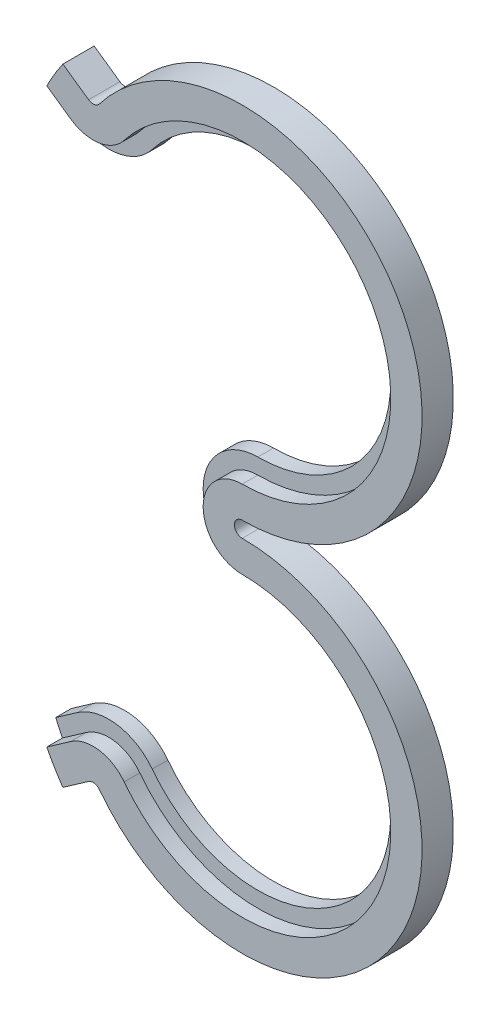
ISO-10303-21;
HEADER;
FILE_DESCRIPTION(('STEP AP214'),'2;1');
FILE_NAME('part.step','',(''),(''),'','','');
FILE_SCHEMA(('AUTOMOTIVE_DESIGN { 1 0 10303 214 1 1 1 1 }'));
ENDSEC;
DATA;
#1=APPLICATION_CONTEXT('core data for automotive mechanical design processes');
#2=APPLICATION_PROTOCOL_DEFINITION('international standard','automotive_design',2000,#1);
#3=PRODUCT_CONTEXT('',#1,'mechanical');
#4=PRODUCT('Part','Part','',(#3));
#5=PRODUCT_RELATED_PRODUCT_CATEGORY('part','',(#4));
#6=PRODUCT_DEFINITION_FORMATION('','',#4);
#7=PRODUCT_DEFINITION_CONTEXT('part definition',#1,'design');
#8=PRODUCT_DEFINITION('design','',#6,#7);
#9=PRODUCT_DEFINITION_SHAPE('','',#8);
#10=(LENGTH_UNIT() NAMED_UNIT(*) SI_UNIT(.MILLI.,.METRE.));
#11=(NAMED_UNIT(*) PLANE_ANGLE_UNIT() SI_UNIT($,.RADIAN.));
#12=(NAMED_UNIT(*) SI_UNIT($,.STERADIAN.) SOLID_ANGLE_UNIT());
#13=UNCERTAINTY_MEASURE_WITH_UNIT(LENGTH_MEASURE(1.E-05),#10,'distance_accuracy_value','');
#14=(GEOMETRIC_REPRESENTATION_CONTEXT(3) GLOBAL_UNCERTAINTY_ASSIGNED_CONTEXT((#13)) GLOBAL_UNIT_ASSIGNED_CONTEXT((#10,
#11,#12)) REPRESENTATION_CONTEXT('',''));
#15=CARTESIAN_POINT('',(0.,0.,0.));
#16=DIRECTION('',(0.,0.,1.));
#17=DIRECTION('',(1.,0.,0.));
#18=AXIS2_PLACEMENT_3D('',#15,#16,#17);
#19=CARTESIAN_POINT('',(-12.9224650406686,17.3860836674432,2.));
#20=DIRECTION('',(0.573576436351046,0.819152044288992,0.));
#21=DIRECTION('',(-0.819152044288992,0.573576436351046,0.));
#22=AXIS2_PLACEMENT_3D('',#19,#20,#21);
#23=PLANE('',#22);
#24=DIRECTION('',(0.819152044288991,-0.573576436351047,0.));
#25=VECTOR('',#24,1.);
#26=CARTESIAN_POINT('',(-12.9224650406686,17.3860836674432,1.));
#27=LINE('',#26,#25);
#28=CARTESIAN_POINT('',(-12.9224650406686,17.3860836674432,1.));
#29=VERTEX_POINT('',#28);
#30=CARTESIAN_POINT('',(-11.5420173000212,16.4194837533373,1.));
#31=VERTEX_POINT('',#30);
#32=EDGE_CURVE('E283',#29,#31,#27,.T.);
#33=ORIENTED_EDGE('',*,*,#32,.F.);
#34=DIRECTION('',(0.,0.,-1.));
#35=VECTOR('',#34,1.);
#36=CARTESIAN_POINT('',(-12.9224650406686,17.3860836674432,2.));
#37=LINE('',#36,#35);
#38=CARTESIAN_POINT('',(-12.9224650406686,17.3860836674432,0.));
#39=VERTEX_POINT('',#38);
#40=EDGE_CURVE('E241',#29,#39,#37,.T.);
#41=ORIENTED_EDGE('',*,*,#40,.T.);
#42=DIRECTION('',(0.819152044288992,-0.573576436351046,0.));
#43=VECTOR('',#42,1.);
#44=CARTESIAN_POINT('',(-12.9224650406686,17.3860836674432,0.));
#45=LINE('',#44,#43);
#46=CARTESIAN_POINT('',(-11.5420173000212,16.4194837533373,0.));
#47=VERTEX_POINT('',#46);
#48=EDGE_CURVE('E175',#39,#47,#45,.T.);
#49=ORIENTED_EDGE('',*,*,#48,.T.);
#50=DIRECTION('',(0.,0.,-1.));
#51=VECTOR('',#50,1.);
#52=CARTESIAN_POINT('',(-11.5420173000212,16.4194837533373,2.));
#53=LINE('',#52,#51);
#54=EDGE_CURVE('E239',#31,#47,#53,.T.);
#55=ORIENTED_EDGE('',*,*,#54,.F.);
#56=EDGE_LOOP('',(#33,#41,#49,#55));
#57=FACE_BOUND('',#56,.T.);
#58=ADVANCED_FACE('F39',(#57),#23,.F.);
#59=CARTESIAN_POINT('',(-9.53449977279251,19.2865159083488,2.));
#60=DIRECTION('',(0.,0.,-1.));
#61=DIRECTION('',(-1.,0.,0.));
#62=AXIS2_PLACEMENT_3D('',#59,#60,#61);
#63=CYLINDRICAL_SURFACE('',#62,3.5);
#64=CARTESIAN_POINT('',(-9.53449977279251,19.2865159083488,1.));
#65=DIRECTION('',(0.,0.,1.));
#66=DIRECTION('',(1.,0.,0.));
#67=AXIS2_PLACEMENT_3D('',#64,#65,#66);
#68=CIRCLE('',#67,3.5);
#69=CARTESIAN_POINT('',(-6.75360400572803,17.161282101747,1.));
#70=VERTEX_POINT('',#69);
#71=EDGE_CURVE('E393',#31,#70,#68,.T.);
#72=ORIENTED_EDGE('',*,*,#71,.F.);
#73=ORIENTED_EDGE('',*,*,#54,.T.);
#74=CARTESIAN_POINT('',(-9.53449977279251,19.2865159083488,0.));
#75=DIRECTION('',(0.,0.,1.));
#76=DIRECTION('',(1.,0.,0.));
#77=AXIS2_PLACEMENT_3D('',#74,#75,#76);
#78=CIRCLE('',#77,3.5);
#79=CARTESIAN_POINT('',(-6.75360400572803,17.161282101747,0.));
#80=VERTEX_POINT('',#79);
#81=EDGE_CURVE('E179',#47,#80,#78,.T.);
#82=ORIENTED_EDGE('',*,*,#81,.T.);
#83=DIRECTION('',(0.,0.,-1.));
#84=VECTOR('',#83,1.);
#85=CARTESIAN_POINT('',(-6.75360400572803,17.161282101747,2.));
#86=LINE('',#85,#84);
#87=EDGE_CURVE('E237',#70,#80,#86,.T.);
#88=ORIENTED_EDGE('',*,*,#87,.F.);
#89=EDGE_LOOP('',(#72,#73,#82,#88));
#90=FACE_BOUND('',#89,.T.);
#91=ADVANCED_FACE('F400',(#90),#63,.T.);
#92=CARTESIAN_POINT('',(0.,12.,2.));
#93=DIRECTION('',(0.,0.,-1.));
#94=DIRECTION('',(-1.,0.,0.));
#95=AXIS2_PLACEMENT_3D('',#92,#93,#94);
#96=CYLINDRICAL_SURFACE('',#95,8.5);
#97=CARTESIAN_POINT('',(0.,12.,1.));
#98=DIRECTION('',(0.,0.,-1.));
#99=DIRECTION('',(1.,0.,0.));
#100=AXIS2_PLACEMENT_3D('',#97,#98,#99);
#101=CIRCLE('',#100,8.5);
#102=CARTESIAN_POINT('',(0.,3.5,1.));
#103=VERTEX_POINT('',#102);
#104=EDGE_CURVE('E402',#70,#103,#101,.T.);
#105=ORIENTED_EDGE('',*,*,#104,.F.);
#106=ORIENTED_EDGE('',*,*,#87,.T.);
#107=CARTESIAN_POINT('',(0.,12.,0.));
#108=DIRECTION('',(0.,0.,-1.));
#109=DIRECTION('',(1.,0.,0.));
#110=AXIS2_PLACEMENT_3D('',#107,#108,#109);
#111=CIRCLE('',#110,8.5);
#112=CARTESIAN_POINT('',(0.,3.5,0.));
#113=VERTEX_POINT('',#112);
#114=EDGE_CURVE('E182',#80,#113,#111,.T.);
#115=ORIENTED_EDGE('',*,*,#114,.T.);
#116=DIRECTION('',(0.,0.,-1.));
#117=VECTOR('',#116,1.);
#118=CARTESIAN_POINT('',(0.,3.5,2.));
#119=LINE('',#118,#117);
#120=EDGE_CURVE('E235',#103,#113,#119,.T.);
#121=ORIENTED_EDGE('',*,*,#120,.F.);
#122=EDGE_LOOP('',(#105,#106,#115,#121));
#123=FACE_BOUND('',#122,.T.);
#124=ADVANCED_FACE('F444',(#123),#96,.F.);
#125=CARTESIAN_POINT('',(0.,0.,2.));
#126=DIRECTION('',(0.,0.,-1.));
#127=DIRECTION('',(-1.,0.,0.));
#128=AXIS2_PLACEMENT_3D('',#125,#126,#127);
#129=CYLINDRICAL_SURFACE('',#128,3.5);
#130=CARTESIAN_POINT('',(0.,0.,1.));
#131=DIRECTION('',(0.,0.,1.));
#132=DIRECTION('',(1.,0.,0.));
#133=AXIS2_PLACEMENT_3D('',#130,#131,#132);
#134=CIRCLE('',#133,3.5);
#135=CARTESIAN_POINT('',(0.,-3.5,1.));
#136=VERTEX_POINT('',#135);
#137=EDGE_CURVE('E404',#103,#136,#134,.T.);
#138=ORIENTED_EDGE('',*,*,#137,.F.);
#139=ORIENTED_EDGE('',*,*,#120,.T.);
#140=CARTESIAN_POINT('',(0.,0.,0.));
#141=DIRECTION('',(0.,0.,1.));
#142=DIRECTION('',(1.,0.,0.));
#143=AXIS2_PLACEMENT_3D('',#140,#141,#142);
#144=CIRCLE('',#143,3.5);
#145=CARTESIAN_POINT('',(0.,-3.5,0.));
#146=VERTEX_POINT('',#145);
#147=EDGE_CURVE('E185',#113,#146,#144,.T.);
#148=ORIENTED_EDGE('',*,*,#147,.T.);
#149=DIRECTION('',(0.,0.,-1.));
#150=VECTOR('',#149,1.);
#151=CARTESIAN_POINT('',(0.,-3.5,2.));
#152=LINE('',#151,#150);
#153=EDGE_CURVE('E233',#136,#146,#152,.T.);
#154=ORIENTED_EDGE('',*,*,#153,.F.);
#155=EDGE_LOOP('',(#138,#139,#148,#154));
#156=FACE_BOUND('',#155,.T.);
#157=ADVANCED_FACE('F449',(#156),#129,.T.);
#158=CARTESIAN_POINT('',(0.,-12.,2.));
#159=DIRECTION('',(0.,0.,-1.));
#160=DIRECTION('',(-1.,0.,0.));
#161=AXIS2_PLACEMENT_3D('',#158,#159,#160);
#162=CYLINDRICAL_SURFACE('',#161,8.5);
#163=CARTESIAN_POINT('',(0.,-12.,1.));
#164=DIRECTION('',(0.,0.,-1.));
#165=DIRECTION('',(1.,0.,0.));
#166=AXIS2_PLACEMENT_3D('',#163,#164,#165);
#167=CIRCLE('',#166,8.5);
#168=CARTESIAN_POINT('',(-6.75360400572803,-17.161282101747,1.));
#169=VERTEX_POINT('',#168);
#170=EDGE_CURVE('E408',#136,#169,#167,.T.);
#171=ORIENTED_EDGE('',*,*,#170,.F.);
#172=ORIENTED_EDGE('',*,*,#153,.T.);
#173=CARTESIAN_POINT('',(0.,-12.,0.));
#174=DIRECTION('',(0.,0.,-1.));
#175=DIRECTION('',(1.,0.,0.));
#176=AXIS2_PLACEMENT_3D('',#173,#174,#175);
#177=CIRCLE('',#176,8.5);
#178=CARTESIAN_POINT('',(-6.75360400572803,-17.161282101747,0.));
#179=VERTEX_POINT('',#178);
#180=EDGE_CURVE('E188',#146,#179,#177,.T.);
#181=ORIENTED_EDGE('',*,*,#180,.T.);
#182=DIRECTION('',(0.,0.,-1.));
#183=VECTOR('',#182,1.);
#184=CARTESIAN_POINT('',(-6.75360400572803,-17.161282101747,2.));
#185=LINE('',#184,#183);
#186=EDGE_CURVE('E231',#169,#179,#185,.T.);
#187=ORIENTED_EDGE('',*,*,#186,.F.);
#188=EDGE_LOOP('',(#171,#172,#181,#187));
#189=FACE_BOUND('',#188,.T.);
#190=ADVANCED_FACE('F453',(#189),#162,.F.);
#191=CARTESIAN_POINT('',(-9.53449977279251,-19.2865159083488,2.));
#192=DIRECTION('',(0.,0.,-1.));
#193=DIRECTION('',(-1.,0.,0.));
#194=AXIS2_PLACEMENT_3D('',#191,#192,#193);
#195=CYLINDRICAL_SURFACE('',#194,3.5);
#196=CARTESIAN_POINT('',(-9.53449977279251,-19.2865159083488,1.));
#197=DIRECTION('',(0.,0.,1.));
#198=DIRECTION('',(1.,0.,0.));
#199=AXIS2_PLACEMENT_3D('',#196,#197,#198);
#200=CIRCLE('',#199,3.5);
#201=CARTESIAN_POINT('',(-11.5420173000212,-16.4194837533373,1.));
#202=VERTEX_POINT('',#201);
#203=EDGE_CURVE('E410',#169,#202,#200,.T.);
#204=ORIENTED_EDGE('',*,*,#203,.F.);
#205=ORIENTED_EDGE('',*,*,#186,.T.);
#206=CARTESIAN_POINT('',(-9.53449977279251,-19.2865159083488,0.));
#207=DIRECTION('',(0.,0.,1.));
#208=DIRECTION('',(1.,0.,0.));
#209=AXIS2_PLACEMENT_3D('',#206,#207,#208);
#210=CIRCLE('',#209,3.5);
#211=CARTESIAN_POINT('',(-11.5420173000212,-16.4194837533373,0.));
#212=VERTEX_POINT('',#211);
#213=EDGE_CURVE('E191',#179,#212,#210,.T.);
#214=ORIENTED_EDGE('',*,*,#213,.T.);
#215=DIRECTION('',(0.,0.,-1.));
#216=VECTOR('',#215,1.);
#217=CARTESIAN_POINT('',(-11.5420173000212,-16.4194837533373,2.));
#218=LINE('',#217,#216);
#219=EDGE_CURVE('E229',#202,#212,#218,.T.);
#220=ORIENTED_EDGE('',*,*,#219,.F.);
#221=EDGE_LOOP('',(#204,#205,#214,#220));
#222=FACE_BOUND('',#221,.T.);
#223=ADVANCED_FACE('F457',(#222),#195,.T.);
#224=CARTESIAN_POINT('',(-11.5420173000212,-16.4194837533373,2.));
#225=DIRECTION('',(0.573576436351046,-0.819152044288992,0.));
#226=DIRECTION('',(0.819152044288992,0.573576436351046,0.));
#227=AXIS2_PLACEMENT_3D('',#224,#225,#226);
#228=PLANE('',#227);
#229=DIRECTION('',(-0.819152044288993,-0.573576436351044,0.));
#230=VECTOR('',#229,1.);
#231=CARTESIAN_POINT('',(-11.5420173000212,-16.4194837533373,1.));
#232=LINE('',#231,#230);
#233=CARTESIAN_POINT('',(-12.9224650406686,-17.3860836674432,1.));
#234=VERTEX_POINT('',#233);
#235=EDGE_CURVE('E412',#202,#234,#232,.T.);
#236=ORIENTED_EDGE('',*,*,#235,.F.);
#237=ORIENTED_EDGE('',*,*,#219,.T.);
#238=DIRECTION('',(-0.819152044288992,-0.573576436351046,0.));
#239=VECTOR('',#238,1.);
#240=CARTESIAN_POINT('',(-11.5420173000212,-16.4194837533373,0.));
#241=LINE('',#240,#239);
#242=CARTESIAN_POINT('',(-12.9224650406686,-17.3860836674432,0.));
#243=VERTEX_POINT('',#242);
#244=EDGE_CURVE('E194',#212,#243,#241,.T.);
#245=ORIENTED_EDGE('',*,*,#244,.T.);
#246=DIRECTION('',(0.,0.,-1.));
#247=VECTOR('',#246,1.);
#248=CARTESIAN_POINT('',(-12.9224650406686,-17.3860836674432,2.));
#249=LINE('',#248,#247);
#250=EDGE_CURVE('E227',#234,#243,#249,.T.);
#251=ORIENTED_EDGE('',*,*,#250,.F.);
#252=EDGE_LOOP('',(#236,#237,#245,#251));
#253=FACE_BOUND('',#252,.T.);
#254=ADVANCED_FACE('F461',(#253),#228,.F.);
#255=CARTESIAN_POINT('',(0.,12.,2.));
#256=DIRECTION('',(0.,0.,-1.));
#257=DIRECTION('',(-1.,0.,0.));
#258=AXIS2_PLACEMENT_3D('',#255,#256,#257);
#259=CYLINDRICAL_SURFACE('',#258,14.);
#260=CARTESIAN_POINT('',(0.,12.,1.));
#261=DIRECTION('',(0.,0.,1.));
#262=DIRECTION('',(1.,0.,0.));
#263=AXIS2_PLACEMENT_3D('',#260,#261,#262);
#264=CIRCLE('',#263,14.);
#265=CARTESIAN_POINT('',(-12.4976565513617,18.3094041496965,1.));
#266=VERTEX_POINT('',#265);
#267=EDGE_CURVE('E176',#266,#29,#264,.T.);
#268=ORIENTED_EDGE('',*,*,#267,.F.);
#269=DIRECTION('',(0.,0.,-1.));
#270=VECTOR('',#269,1.);
#271=CARTESIAN_POINT('',(-12.4976565513617,18.3094041496965,2.));
#272=LINE('',#271,#270);
#273=CARTESIAN_POINT('',(-12.4976565513617,18.3094041496965,2.));
#274=VERTEX_POINT('',#273);
#275=EDGE_CURVE('E299',#266,#274,#272,.F.);
#276=ORIENTED_EDGE('',*,*,#275,.T.);
#277=CARTESIAN_POINT('',(0.,12.,2.));
#278=DIRECTION('',(0.,0.,1.));
#279=DIRECTION('',(1.,0.,0.));
#280=AXIS2_PLACEMENT_3D('',#277,#278,#279);
#281=CIRCLE('',#280,14.);
#282=CARTESIAN_POINT('',(-11.4681286200459,20.0300701089146,2.));
#283=VERTEX_POINT('',#282);
#284=EDGE_CURVE('E211',#283,#274,#281,.T.);
#285=ORIENTED_EDGE('',*,*,#284,.F.);
#286=DIRECTION('',(0.,0.,-1.));
#287=VECTOR('',#286,1.);
#288=CARTESIAN_POINT('',(-11.4681286200459,20.0300701089146,2.));
#289=LINE('',#288,#287);
#290=CARTESIAN_POINT('',(-11.4681286200459,20.0300701089146,0.));
#291=VERTEX_POINT('',#290);
#292=EDGE_CURVE('E168',#283,#291,#289,.T.);
#293=ORIENTED_EDGE('',*,*,#292,.T.);
#294=CARTESIAN_POINT('',(0.,12.,0.));
#295=DIRECTION('',(0.,0.,1.));
#296=DIRECTION('',(1.,0.,0.));
#297=AXIS2_PLACEMENT_3D('',#294,#295,#296);
#298=CIRCLE('',#297,14.);
#299=EDGE_CURVE('E172',#291,#39,#298,.T.);
#300=ORIENTED_EDGE('',*,*,#299,.T.);
#301=ORIENTED_EDGE('',*,*,#40,.F.);
#302=EDGE_LOOP('',(#268,#276,#285,#293,#300,#301));
#303=FACE_BOUND('',#302,.T.);
#304=ADVANCED_FACE('F41',(#303),#259,.T.);
#305=CARTESIAN_POINT('',(0.,-12.,2.));
#306=DIRECTION('',(0.,0.,-1.));
#307=DIRECTION('',(-1.,0.,0.));
#308=AXIS2_PLACEMENT_3D('',#305,#306,#307);
#309=CYLINDRICAL_SURFACE('',#308,14.);
#310=CARTESIAN_POINT('',(0.,-12.,2.));
#311=DIRECTION('',(0.,0.,1.));
#312=DIRECTION('',(1.,0.,0.));
#313=AXIS2_PLACEMENT_3D('',#310,#311,#312);
#314=CIRCLE('',#313,14.);
#315=CARTESIAN_POINT('',(-12.4976565513617,-18.3094041496964,2.));
#316=VERTEX_POINT('',#315);
#317=CARTESIAN_POINT('',(-11.4681286200459,-20.0300701089146,2.));
#318=VERTEX_POINT('',#317);
#319=EDGE_CURVE('E127',#316,#318,#314,.T.);
#320=ORIENTED_EDGE('',*,*,#319,.F.);
#321=DIRECTION('',(0.,0.,-1.));
#322=VECTOR('',#321,1.);
#323=CARTESIAN_POINT('',(-12.4976565513617,-18.3094041496964,2.));
#324=LINE('',#323,#322);
#325=CARTESIAN_POINT('',(-12.4976565513617,-18.3094041496964,1.));
#326=VERTEX_POINT('',#325);
#327=EDGE_CURVE('E54',#316,#326,#324,.T.);
#328=ORIENTED_EDGE('',*,*,#327,.T.);
#329=CARTESIAN_POINT('',(0.,-12.,1.));
#330=DIRECTION('',(0.,0.,1.));
#331=DIRECTION('',(1.,0.,0.));
#332=AXIS2_PLACEMENT_3D('',#329,#330,#331);
#333=CIRCLE('',#332,14.);
#334=EDGE_CURVE('E11',#234,#326,#333,.T.);
#335=ORIENTED_EDGE('',*,*,#334,.F.);
#336=ORIENTED_EDGE('',*,*,#250,.T.);
#337=CARTESIAN_POINT('',(0.,-12.,0.));
#338=DIRECTION('',(0.,0.,1.));
#339=DIRECTION('',(1.,0.,0.));
#340=AXIS2_PLACEMENT_3D('',#337,#338,#339);
#341=CIRCLE('',#340,14.);
#342=CARTESIAN_POINT('',(-11.4681286200459,-20.0300701089146,0.));
#343=VERTEX_POINT('',#342);
#344=EDGE_CURVE('E197',#243,#343,#341,.T.);
#345=ORIENTED_EDGE('',*,*,#344,.T.);
#346=DIRECTION('',(0.,0.,-1.));
#347=VECTOR('',#346,1.);
#348=CARTESIAN_POINT('',(-11.4681286200459,-20.0300701089146,2.));
#349=LINE('',#348,#347);
#350=EDGE_CURVE('E224',#318,#343,#349,.T.);
#351=ORIENTED_EDGE('',*,*,#350,.F.);
#352=EDGE_LOOP('',(#320,#328,#335,#336,#345,#351));
#353=FACE_BOUND('',#352,.T.);
#354=ADVANCED_FACE('F466',(#353),#309,.T.);
#355=CARTESIAN_POINT('',(-11.4681286200459,-20.0300701089146,2.));
#356=DIRECTION('',(-0.573576436351044,0.819152044288993,0.));
#357=DIRECTION('',(-0.819152044288993,-0.573576436351044,0.));
#358=AXIS2_PLACEMENT_3D('',#355,#356,#357);
#359=PLANE('',#358);
#360=DIRECTION('',(0.819152044288993,0.573576436351044,0.));
#361=VECTOR('',#360,1.);
#362=CARTESIAN_POINT('',(-11.4681286200459,-20.0300701089146,0.));
#363=LINE('',#362,#361);
#364=CARTESIAN_POINT('',(-9.82128799096802,-18.8769398862043,0.));
#365=VERTEX_POINT('',#364);
#366=EDGE_CURVE('E199',#343,#365,#363,.T.);
#367=ORIENTED_EDGE('',*,*,#366,.T.);
#368=DIRECTION('',(0.,0.,-1.));
#369=VECTOR('',#368,1.);
#370=CARTESIAN_POINT('',(-9.82128799096802,-18.8769398862043,2.));
#371=LINE('',#370,#369);
#372=CARTESIAN_POINT('',(-9.82128799096802,-18.8769398862043,2.));
#373=VERTEX_POINT('',#372);
#374=EDGE_CURVE('E221',#373,#365,#371,.T.);
#375=ORIENTED_EDGE('',*,*,#374,.F.);
#376=DIRECTION('',(0.819152044288993,0.573576436351044,0.));
#377=VECTOR('',#376,1.);
#378=CARTESIAN_POINT('',(-11.4681286200459,-20.0300701089146,2.));
#379=LINE('',#378,#377);
#380=EDGE_CURVE('E306',#318,#373,#379,.T.);
#381=ORIENTED_EDGE('',*,*,#380,.F.);
#382=ORIENTED_EDGE('',*,*,#350,.T.);
#383=EDGE_LOOP('',(#367,#375,#381,#382));
#384=FACE_BOUND('',#383,.T.);
#385=ADVANCED_FACE('F469',(#384),#359,.F.);
#386=CARTESIAN_POINT('',(-9.53449977279251,-19.2865159083488,2.));
#387=DIRECTION('',(0.,0.,-1.));
#388=DIRECTION('',(-1.,0.,0.));
#389=AXIS2_PLACEMENT_3D('',#386,#387,#388);
#390=CYLINDRICAL_SURFACE('',#389,0.499999999999996);
#391=CARTESIAN_POINT('',(-9.53449977279251,-19.2865159083488,0.));
#392=DIRECTION('',(0.,0.,-1.));
#393=DIRECTION('',(1.,0.,0.));
#394=AXIS2_PLACEMENT_3D('',#391,#392,#393);
#395=CIRCLE('',#394,0.499999999999996);
#396=CARTESIAN_POINT('',(-9.13722894892615,-18.9829110788342,0.));
#397=VERTEX_POINT('',#396);
#398=EDGE_CURVE('E201',#365,#397,#395,.T.);
#399=ORIENTED_EDGE('',*,*,#398,.T.);
#400=DIRECTION('',(0.,0.,-1.));
#401=VECTOR('',#400,1.);
#402=CARTESIAN_POINT('',(-9.13722894892615,-18.9829110788342,2.));
#403=LINE('',#402,#401);
#404=CARTESIAN_POINT('',(-9.13722894892615,-18.9829110788342,2.));
#405=VERTEX_POINT('',#404);
#406=EDGE_CURVE('E218',#405,#397,#403,.T.);
#407=ORIENTED_EDGE('',*,*,#406,.F.);
#408=CARTESIAN_POINT('',(-9.53449977279251,-19.2865159083488,2.));
#409=DIRECTION('',(0.,0.,-1.));
#410=DIRECTION('',(1.,0.,0.));
#411=AXIS2_PLACEMENT_3D('',#408,#409,#410);
#412=CIRCLE('',#411,0.499999999999996);
#413=EDGE_CURVE('E308',#373,#405,#412,.T.);
#414=ORIENTED_EDGE('',*,*,#413,.F.);
#415=ORIENTED_EDGE('',*,*,#374,.T.);
#416=EDGE_LOOP('',(#399,#407,#414,#415));
#417=FACE_BOUND('',#416,.T.);
#418=ADVANCED_FACE('F473',(#417),#390,.F.);
#419=CARTESIAN_POINT('',(0.,-12.,2.));
#420=DIRECTION('',(0.,0.,-1.));
#421=DIRECTION('',(-1.,0.,0.));
#422=AXIS2_PLACEMENT_3D('',#419,#420,#421);
#423=CYLINDRICAL_SURFACE('',#422,11.5);
#424=CARTESIAN_POINT('',(0.,-12.,0.));
#425=DIRECTION('',(0.,0.,1.));
#426=DIRECTION('',(1.,0.,0.));
#427=AXIS2_PLACEMENT_3D('',#424,#425,#426);
#428=CIRCLE('',#427,11.5);
#429=CARTESIAN_POINT('',(0.,-0.500000000000003,0.));
#430=VERTEX_POINT('',#429);
#431=EDGE_CURVE('E203',#397,#430,#428,.T.);
#432=ORIENTED_EDGE('',*,*,#431,.T.);
#433=DIRECTION('',(0.,0.,-1.));
#434=VECTOR('',#433,1.);
#435=CARTESIAN_POINT('',(0.,-0.500000000000003,2.));
#436=LINE('',#435,#434);
#437=CARTESIAN_POINT('',(0.,-0.500000000000003,2.));
#438=VERTEX_POINT('',#437);
#439=EDGE_CURVE('E215',#438,#430,#436,.T.);
#440=ORIENTED_EDGE('',*,*,#439,.F.);
#441=CARTESIAN_POINT('',(0.,-12.,2.));
#442=DIRECTION('',(0.,0.,1.));
#443=DIRECTION('',(1.,0.,0.));
#444=AXIS2_PLACEMENT_3D('',#441,#442,#443);
#445=CIRCLE('',#444,11.5);
#446=EDGE_CURVE('E310',#405,#438,#445,.T.);
#447=ORIENTED_EDGE('',*,*,#446,.F.);
#448=ORIENTED_EDGE('',*,*,#406,.T.);
#449=EDGE_LOOP('',(#432,#440,#447,#448));
#450=FACE_BOUND('',#449,.T.);
#451=ADVANCED_FACE('F316',(#450),#423,.T.);
#452=CARTESIAN_POINT('',(0.,0.,2.));
#453=DIRECTION('',(0.,0.,-1.));
#454=DIRECTION('',(-1.,0.,0.));
#455=AXIS2_PLACEMENT_3D('',#452,#453,#454);
#456=CYLINDRICAL_SURFACE('',#455,0.500000000000003);
#457=CARTESIAN_POINT('',(0.,0.,0.));
#458=DIRECTION('',(0.,0.,-1.));
#459=DIRECTION('',(1.,0.,0.));
#460=AXIS2_PLACEMENT_3D('',#457,#458,#459);
#461=CIRCLE('',#460,0.500000000000003);
#462=CARTESIAN_POINT('',(0.,0.500000000000004,0.));
#463=VERTEX_POINT('',#462);
#464=EDGE_CURVE('E205',#430,#463,#461,.T.);
#465=ORIENTED_EDGE('',*,*,#464,.T.);
#466=DIRECTION('',(0.,0.,-1.));
#467=VECTOR('',#466,1.);
#468=CARTESIAN_POINT('',(0.,0.500000000000004,2.));
#469=LINE('',#468,#467);
#470=CARTESIAN_POINT('',(0.,0.500000000000004,2.));
#471=VERTEX_POINT('',#470);
#472=EDGE_CURVE('E163',#471,#463,#469,.T.);
#473=ORIENTED_EDGE('',*,*,#472,.F.);
#474=CARTESIAN_POINT('',(0.,0.,2.));
#475=DIRECTION('',(0.,0.,-1.));
#476=DIRECTION('',(1.,0.,0.));
#477=AXIS2_PLACEMENT_3D('',#474,#475,#476);
#478=CIRCLE('',#477,0.500000000000003);
#479=EDGE_CURVE('E151',#438,#471,#478,.T.);
#480=ORIENTED_EDGE('',*,*,#479,.F.);
#481=ORIENTED_EDGE('',*,*,#439,.T.);
#482=EDGE_LOOP('',(#465,#473,#480,#481));
#483=FACE_BOUND('',#482,.T.);
#484=ADVANCED_FACE('F320',(#483),#456,.F.);
#485=CARTESIAN_POINT('',(0.,12.,2.));
#486=DIRECTION('',(0.,0.,-1.));
#487=DIRECTION('',(-1.,0.,0.));
#488=AXIS2_PLACEMENT_3D('',#485,#486,#487);
#489=CYLINDRICAL_SURFACE('',#488,11.5);
#490=CARTESIAN_POINT('',(0.,12.,0.));
#491=DIRECTION('',(0.,0.,1.));
#492=DIRECTION('',(1.,0.,0.));
#493=AXIS2_PLACEMENT_3D('',#490,#491,#492);
#494=CIRCLE('',#493,11.5);
#495=CARTESIAN_POINT('',(-9.13722894892616,18.9829110788342,0.));
#496=VERTEX_POINT('',#495);
#497=EDGE_CURVE('E160',#463,#496,#494,.T.);
#498=ORIENTED_EDGE('',*,*,#497,.T.);
#499=DIRECTION('',(0.,0.,-1.));
#500=VECTOR('',#499,1.);
#501=CARTESIAN_POINT('',(-9.13722894892616,18.9829110788342,2.));
#502=LINE('',#501,#500);
#503=CARTESIAN_POINT('',(-9.13722894892616,18.9829110788342,2.));
#504=VERTEX_POINT('',#503);
#505=EDGE_CURVE('E157',#504,#496,#502,.T.);
#506=ORIENTED_EDGE('',*,*,#505,.F.);
#507=CARTESIAN_POINT('',(0.,12.,2.));
#508=DIRECTION('',(0.,0.,1.));
#509=DIRECTION('',(1.,0.,0.));
#510=AXIS2_PLACEMENT_3D('',#507,#508,#509);
#511=CIRCLE('',#510,11.5);
#512=EDGE_CURVE('E143',#471,#504,#511,.T.);
#513=ORIENTED_EDGE('',*,*,#512,.F.);
#514=ORIENTED_EDGE('',*,*,#472,.T.);
#515=EDGE_LOOP('',(#498,#506,#513,#514));
#516=FACE_BOUND('',#515,.T.);
#517=ADVANCED_FACE('F158',(#516),#489,.T.);
#518=CARTESIAN_POINT('',(-9.53449977279251,19.2865159083488,2.));
#519=DIRECTION('',(0.,0.,-1.));
#520=DIRECTION('',(-1.,0.,0.));
#521=AXIS2_PLACEMENT_3D('',#518,#519,#520);
#522=CYLINDRICAL_SURFACE('',#521,0.499999999999997);
#523=CARTESIAN_POINT('',(-9.53449977279251,19.2865159083488,0.));
#524=DIRECTION('',(0.,0.,-1.));
#525=DIRECTION('',(1.,0.,0.));
#526=AXIS2_PLACEMENT_3D('',#523,#524,#525);
#527=CIRCLE('',#526,0.499999999999997);
#528=CARTESIAN_POINT('',(-9.82128799096802,18.8769398862043,0.));
#529=VERTEX_POINT('',#528);
#530=EDGE_CURVE('E208',#496,#529,#527,.T.);
#531=ORIENTED_EDGE('',*,*,#530,.T.);
#532=DIRECTION('',(0.,0.,-1.));
#533=VECTOR('',#532,1.);
#534=CARTESIAN_POINT('',(-9.82128799096802,18.8769398862043,2.));
#535=LINE('',#534,#533);
#536=CARTESIAN_POINT('',(-9.82128799096802,18.8769398862043,2.));
#537=VERTEX_POINT('',#536);
#538=EDGE_CURVE('E164',#537,#529,#535,.T.);
#539=ORIENTED_EDGE('',*,*,#538,.F.);
#540=CARTESIAN_POINT('',(-9.53449977279251,19.2865159083488,2.));
#541=DIRECTION('',(0.,0.,-1.));
#542=DIRECTION('',(1.,0.,0.));
#543=AXIS2_PLACEMENT_3D('',#540,#541,#542);
#544=CIRCLE('',#543,0.499999999999997);
#545=EDGE_CURVE('E148',#504,#537,#544,.T.);
#546=ORIENTED_EDGE('',*,*,#545,.F.);
#547=ORIENTED_EDGE('',*,*,#505,.T.);
#548=EDGE_LOOP('',(#531,#539,#546,#547));
#549=FACE_BOUND('',#548,.T.);
#550=ADVANCED_FACE('F166',(#549),#522,.F.);
#551=CARTESIAN_POINT('',(-9.82128799096802,18.8769398862043,2.));
#552=DIRECTION('',(-0.573576436351045,-0.819152044288993,0.));
#553=DIRECTION('',(0.819152044288993,-0.573576436351045,0.));
#554=AXIS2_PLACEMENT_3D('',#551,#552,#553);
#555=PLANE('',#554);
#556=DIRECTION('',(-0.819152044288993,0.573576436351045,0.));
#557=VECTOR('',#556,1.);
#558=CARTESIAN_POINT('',(-9.82128799096802,18.8769398862043,0.));
#559=LINE('',#558,#557);
#560=EDGE_CURVE('E120',#529,#291,#559,.T.);
#561=ORIENTED_EDGE('',*,*,#560,.T.);
#562=ORIENTED_EDGE('',*,*,#292,.F.);
#563=DIRECTION('',(-0.819152044288993,0.573576436351045,0.));
#564=VECTOR('',#563,1.);
#565=CARTESIAN_POINT('',(-9.82128799096802,18.8769398862043,2.));
#566=LINE('',#565,#564);
#567=EDGE_CURVE('E63',#537,#283,#566,.T.);
#568=ORIENTED_EDGE('',*,*,#567,.F.);
#569=ORIENTED_EDGE('',*,*,#538,.T.);
#570=EDGE_LOOP('',(#561,#562,#568,#569));
#571=FACE_BOUND('',#570,.T.);
#572=ADVANCED_FACE('F324',(#571),#555,.F.);
#573=CARTESIAN_POINT('',(0.,12.,2.));
#574=DIRECTION('',(0.,0.,1.));
#575=DIRECTION('',(1.,0.,0.));
#576=AXIS2_PLACEMENT_3D('',#573,#574,#575);
#577=PLANE('',#576);
#578=DIRECTION('',(-0.819152044288993,0.573576436351044,0.));
#579=VECTOR('',#578,1.);
#580=CARTESIAN_POINT('',(-12.3488886043175,18.2052357117322,2.));
#581=LINE('',#580,#579);
#582=CARTESIAN_POINT('',(-10.9684408636701,17.2386357976263,2.));
#583=VERTEX_POINT('',#582);
#584=EDGE_CURVE('E280',#583,#274,#581,.T.);
#585=ORIENTED_EDGE('',*,*,#584,.F.);
#586=CARTESIAN_POINT('',(-9.53449977279251,19.2865159083488,2.));
#587=DIRECTION('',(0.,0.,-1.));
#588=DIRECTION('',(1.,0.,0.));
#589=AXIS2_PLACEMENT_3D('',#586,#587,#588);
#590=CIRCLE('',#589,2.5);
#591=CARTESIAN_POINT('',(-7.54814565346074,17.7684917607761,2.));
#592=VERTEX_POINT('',#591);
#593=EDGE_CURVE('E277',#592,#583,#590,.T.);
#594=ORIENTED_EDGE('',*,*,#593,.F.);
#595=CARTESIAN_POINT('',(0.,12.,2.));
#596=DIRECTION('',(0.,0.,1.));
#597=DIRECTION('',(1.,0.,0.));
#598=AXIS2_PLACEMENT_3D('',#595,#596,#597);
#599=CIRCLE('',#598,9.5);
#600=CARTESIAN_POINT('',(0.,2.5,2.));
#601=VERTEX_POINT('',#600);
#602=EDGE_CURVE('E274',#601,#592,#599,.T.);
#603=ORIENTED_EDGE('',*,*,#602,.F.);
#604=CARTESIAN_POINT('',(0.,0.,2.));
#605=DIRECTION('',(0.,0.,-1.));
#606=DIRECTION('',(1.,0.,0.));
#607=AXIS2_PLACEMENT_3D('',#604,#605,#606);
#608=CIRCLE('',#607,2.5);
#609=CARTESIAN_POINT('',(0.,-2.5,2.));
#610=VERTEX_POINT('',#609);
#611=EDGE_CURVE('E267',#610,#601,#608,.T.);
#612=ORIENTED_EDGE('',*,*,#611,.F.);
#613=CARTESIAN_POINT('',(0.,-12.,2.));
#614=DIRECTION('',(0.,0.,1.));
#615=DIRECTION('',(1.,0.,0.));
#616=AXIS2_PLACEMENT_3D('',#613,#614,#615);
#617=CIRCLE('',#616,9.5);
#618=CARTESIAN_POINT('',(-7.54814565346074,-17.7684917607761,2.));
#619=VERTEX_POINT('',#618);
#620=EDGE_CURVE('E265',#619,#610,#617,.T.);
#621=ORIENTED_EDGE('',*,*,#620,.F.);
#622=CARTESIAN_POINT('',(-9.53449977279251,-19.2865159083488,2.));
#623=DIRECTION('',(0.,0.,-1.));
#624=DIRECTION('',(1.,0.,0.));
#625=AXIS2_PLACEMENT_3D('',#622,#623,#624);
#626=CIRCLE('',#625,2.5);
#627=CARTESIAN_POINT('',(-10.9684408636701,-17.2386357976263,2.));
#628=VERTEX_POINT('',#627);
#629=EDGE_CURVE('E256',#628,#619,#626,.T.);
#630=ORIENTED_EDGE('',*,*,#629,.F.);
#631=DIRECTION('',(0.819152044288993,0.573576436351044,0.));
#632=VECTOR('',#631,1.);
#633=CARTESIAN_POINT('',(10.1291585767288,-2.46593763133009,2.));
#634=LINE('',#633,#632);
#635=EDGE_CURVE('E47',#316,#628,#634,.T.);
#636=ORIENTED_EDGE('',*,*,#635,.F.);
#637=ORIENTED_EDGE('',*,*,#319,.T.);
#638=ORIENTED_EDGE('',*,*,#380,.T.);
#639=ORIENTED_EDGE('',*,*,#413,.T.);
#640=ORIENTED_EDGE('',*,*,#446,.T.);
#641=ORIENTED_EDGE('',*,*,#479,.T.);
#642=ORIENTED_EDGE('',*,*,#512,.T.);
#643=ORIENTED_EDGE('',*,*,#545,.T.);
#644=ORIENTED_EDGE('',*,*,#567,.T.);
#645=ORIENTED_EDGE('',*,*,#284,.T.);
#646=EDGE_LOOP('',(#585,#594,#603,#612,#621,#630,#636,#637,#638,#639,#640,#641,#642,#643,#644,#645));
#647=FACE_BOUND('',#646,.T.);
#648=ADVANCED_FACE('F146',(#647),#577,.T.);
#649=CARTESIAN_POINT('',(0.,12.,0.));
#650=DIRECTION('',(0.,0.,1.));
#651=DIRECTION('',(1.,0.,0.));
#652=AXIS2_PLACEMENT_3D('',#649,#650,#651);
#653=PLANE('',#652);
#654=ORIENTED_EDGE('',*,*,#299,.F.);
#655=ORIENTED_EDGE('',*,*,#560,.F.);
#656=ORIENTED_EDGE('',*,*,#530,.F.);
#657=ORIENTED_EDGE('',*,*,#497,.F.);
#658=ORIENTED_EDGE('',*,*,#464,.F.);
#659=ORIENTED_EDGE('',*,*,#431,.F.);
#660=ORIENTED_EDGE('',*,*,#398,.F.);
#661=ORIENTED_EDGE('',*,*,#366,.F.);
#662=ORIENTED_EDGE('',*,*,#344,.F.);
#663=ORIENTED_EDGE('',*,*,#244,.F.);
#664=ORIENTED_EDGE('',*,*,#213,.F.);
#665=ORIENTED_EDGE('',*,*,#180,.F.);
#666=ORIENTED_EDGE('',*,*,#147,.F.);
#667=ORIENTED_EDGE('',*,*,#114,.F.);
#668=ORIENTED_EDGE('',*,*,#81,.F.);
#669=ORIENTED_EDGE('',*,*,#48,.F.);
#670=EDGE_LOOP('',(#654,#655,#656,#657,#658,#659,#660,#661,#662,#663,#664,#665,#666,#667,#668,#669));
#671=FACE_BOUND('',#670,.T.);
#672=ADVANCED_FACE('F323',(#671),#653,.F.);
#673=CARTESIAN_POINT('',(-9.53449977279251,19.2865159083488,1.));
#674=DIRECTION('',(0.,0.,1.));
#675=DIRECTION('',(1.,0.,0.));
#676=AXIS2_PLACEMENT_3D('',#673,#674,#675);
#677=PLANE('',#676);
#678=ORIENTED_EDGE('',*,*,#267,.T.);
#679=ORIENTED_EDGE('',*,*,#32,.T.);
#680=ORIENTED_EDGE('',*,*,#71,.T.);
#681=ORIENTED_EDGE('',*,*,#104,.T.);
#682=ORIENTED_EDGE('',*,*,#137,.T.);
#683=ORIENTED_EDGE('',*,*,#170,.T.);
#684=ORIENTED_EDGE('',*,*,#203,.T.);
#685=ORIENTED_EDGE('',*,*,#235,.T.);
#686=ORIENTED_EDGE('',*,*,#334,.T.);
#687=DIRECTION('',(0.819152044288995,0.573576436351042,0.));
#688=VECTOR('',#687,1.);
#689=CARTESIAN_POINT('',(-12.3488886043175,-18.2052357117322,1.));
#690=LINE('',#689,#688);
#691=CARTESIAN_POINT('',(-10.9684408636701,-17.2386357976263,1.));
#692=VERTEX_POINT('',#691);
#693=EDGE_CURVE('E414',#326,#692,#690,.T.);
#694=ORIENTED_EDGE('',*,*,#693,.T.);
#695=CARTESIAN_POINT('',(-9.53449977279251,-19.2865159083488,1.));
#696=DIRECTION('',(0.,0.,-1.));
#697=DIRECTION('',(1.,0.,0.));
#698=AXIS2_PLACEMENT_3D('',#695,#696,#697);
#699=CIRCLE('',#698,2.5);
#700=CARTESIAN_POINT('',(-7.54814565346074,-17.7684917607761,1.));
#701=VERTEX_POINT('',#700);
#702=EDGE_CURVE('E259',#692,#701,#699,.T.);
#703=ORIENTED_EDGE('',*,*,#702,.T.);
#704=CARTESIAN_POINT('',(0.,-12.,1.));
#705=DIRECTION('',(0.,0.,1.));
#706=DIRECTION('',(1.,0.,0.));
#707=AXIS2_PLACEMENT_3D('',#704,#705,#706);
#708=CIRCLE('',#707,9.5);
#709=CARTESIAN_POINT('',(0.,-2.5,1.));
#710=VERTEX_POINT('',#709);
#711=EDGE_CURVE('E417',#701,#710,#708,.T.);
#712=ORIENTED_EDGE('',*,*,#711,.T.);
#713=CARTESIAN_POINT('',(0.,0.,1.));
#714=DIRECTION('',(0.,0.,-1.));
#715=DIRECTION('',(1.,0.,0.));
#716=AXIS2_PLACEMENT_3D('',#713,#714,#715);
#717=CIRCLE('',#716,2.5);
#718=CARTESIAN_POINT('',(0.,2.5,1.));
#719=VERTEX_POINT('',#718);
#720=EDGE_CURVE('E420',#710,#719,#717,.T.);
#721=ORIENTED_EDGE('',*,*,#720,.T.);
#722=CARTESIAN_POINT('',(0.,12.,1.));
#723=DIRECTION('',(0.,0.,1.));
#724=DIRECTION('',(1.,0.,0.));
#725=AXIS2_PLACEMENT_3D('',#722,#723,#724);
#726=CIRCLE('',#725,9.5);
#727=CARTESIAN_POINT('',(-7.54814565346074,17.7684917607761,1.));
#728=VERTEX_POINT('',#727);
#729=EDGE_CURVE('E423',#719,#728,#726,.T.);
#730=ORIENTED_EDGE('',*,*,#729,.T.);
#731=CARTESIAN_POINT('',(-9.53449977279251,19.2865159083488,1.));
#732=DIRECTION('',(0.,0.,-1.));
#733=DIRECTION('',(1.,0.,0.));
#734=AXIS2_PLACEMENT_3D('',#731,#732,#733);
#735=CIRCLE('',#734,2.5);
#736=CARTESIAN_POINT('',(-10.9684408636701,17.2386357976263,1.));
#737=VERTEX_POINT('',#736);
#738=EDGE_CURVE('E425',#728,#737,#735,.T.);
#739=ORIENTED_EDGE('',*,*,#738,.T.);
#740=DIRECTION('',(-0.819152044288991,0.573576436351047,0.));
#741=VECTOR('',#740,1.);
#742=CARTESIAN_POINT('',(-12.3488886043175,18.2052357117322,1.));
#743=LINE('',#742,#741);
#744=EDGE_CURVE('E261',#737,#266,#743,.T.);
#745=ORIENTED_EDGE('',*,*,#744,.T.);
#746=EDGE_LOOP('',(#678,#679,#680,#681,#682,#683,#684,#685,#686,#694,#703,#712,#721,#730,#739,#745));
#747=FACE_BOUND('',#746,.T.);
#748=ADVANCED_FACE('F385',(#747),#677,.T.);
#749=CARTESIAN_POINT('',(-12.3488886043175,18.2052357117322,1.));
#750=DIRECTION('',(0.573576436351044,0.819152044288993,0.));
#751=DIRECTION('',(-0.819152044288993,0.573576436351044,0.));
#752=AXIS2_PLACEMENT_3D('',#749,#750,#751);
#753=PLANE('',#752);
#754=ORIENTED_EDGE('',*,*,#744,.F.);
#755=DIRECTION('',(0.,0.,1.));
#756=VECTOR('',#755,1.);
#757=CARTESIAN_POINT('',(-10.9684408636701,17.2386357976263,1.));
#758=LINE('',#757,#756);
#759=EDGE_CURVE('E284',#737,#583,#758,.T.);
#760=ORIENTED_EDGE('',*,*,#759,.T.);
#761=ORIENTED_EDGE('',*,*,#584,.T.);
#762=ORIENTED_EDGE('',*,*,#275,.F.);
#763=EDGE_LOOP('',(#754,#760,#761,#762));
#764=FACE_BOUND('',#763,.T.);
#765=ADVANCED_FACE('F430',(#764),#753,.F.);
#766=CARTESIAN_POINT('',(-10.9684408636701,-17.2386357976263,1.));
#767=DIRECTION('',(0.573576436351044,-0.819152044288993,0.));
#768=DIRECTION('',(0.819152044288993,0.573576436351044,0.));
#769=AXIS2_PLACEMENT_3D('',#766,#767,#768);
#770=PLANE('',#769);
#771=ORIENTED_EDGE('',*,*,#635,.T.);
#772=DIRECTION('',(0.,0.,1.));
#773=VECTOR('',#772,1.);
#774=CARTESIAN_POINT('',(-10.9684408636701,-17.2386357976263,1.));
#775=LINE('',#774,#773);
#776=EDGE_CURVE('E247',#692,#628,#775,.T.);
#777=ORIENTED_EDGE('',*,*,#776,.F.);
#778=ORIENTED_EDGE('',*,*,#693,.F.);
#779=ORIENTED_EDGE('',*,*,#327,.F.);
#780=EDGE_LOOP('',(#771,#777,#778,#779));
#781=FACE_BOUND('',#780,.T.);
#782=ADVANCED_FACE('F245',(#781),#770,.F.);
#783=CARTESIAN_POINT('',(-9.53449977279251,19.2865159083488,1.));
#784=DIRECTION('',(0.,0.,1.));
#785=DIRECTION('',(1.,0.,0.));
#786=AXIS2_PLACEMENT_3D('',#783,#784,#785);
#787=CYLINDRICAL_SURFACE('',#786,2.5);
#788=ORIENTED_EDGE('',*,*,#593,.T.);
#789=ORIENTED_EDGE('',*,*,#759,.F.);
#790=ORIENTED_EDGE('',*,*,#738,.F.);
#791=DIRECTION('',(0.,0.,1.));
#792=VECTOR('',#791,1.);
#793=CARTESIAN_POINT('',(-7.54814565346074,17.7684917607761,1.));
#794=LINE('',#793,#792);
#795=EDGE_CURVE('E287',#728,#592,#794,.T.);
#796=ORIENTED_EDGE('',*,*,#795,.T.);
#797=EDGE_LOOP('',(#788,#789,#790,#796));
#798=FACE_BOUND('',#797,.T.);
#799=ADVANCED_FACE('F429',(#798),#787,.T.);
#800=CARTESIAN_POINT('',(0.,12.,1.));
#801=DIRECTION('',(0.,0.,1.));
#802=DIRECTION('',(1.,0.,0.));
#803=AXIS2_PLACEMENT_3D('',#800,#801,#802);
#804=CYLINDRICAL_SURFACE('',#803,9.5);
#805=ORIENTED_EDGE('',*,*,#602,.T.);
#806=ORIENTED_EDGE('',*,*,#795,.F.);
#807=ORIENTED_EDGE('',*,*,#729,.F.);
#808=DIRECTION('',(0.,0.,1.));
#809=VECTOR('',#808,1.);
#810=CARTESIAN_POINT('',(0.,2.5,1.));
#811=LINE('',#810,#809);
#812=EDGE_CURVE('E290',#719,#601,#811,.T.);
#813=ORIENTED_EDGE('',*,*,#812,.T.);
#814=EDGE_LOOP('',(#805,#806,#807,#813));
#815=FACE_BOUND('',#814,.T.);
#816=ADVANCED_FACE('F501',(#815),#804,.F.);
#817=CARTESIAN_POINT('',(0.,0.,1.));
#818=DIRECTION('',(0.,0.,1.));
#819=DIRECTION('',(1.,0.,0.));
#820=AXIS2_PLACEMENT_3D('',#817,#818,#819);
#821=CYLINDRICAL_SURFACE('',#820,2.5);
#822=ORIENTED_EDGE('',*,*,#611,.T.);
#823=ORIENTED_EDGE('',*,*,#812,.F.);
#824=ORIENTED_EDGE('',*,*,#720,.F.);
#825=DIRECTION('',(0.,0.,1.));
#826=VECTOR('',#825,1.);
#827=CARTESIAN_POINT('',(0.,-2.5,1.));
#828=LINE('',#827,#826);
#829=EDGE_CURVE('E293',#710,#610,#828,.T.);
#830=ORIENTED_EDGE('',*,*,#829,.T.);
#831=EDGE_LOOP('',(#822,#823,#824,#830));
#832=FACE_BOUND('',#831,.T.);
#833=ADVANCED_FACE('F497',(#832),#821,.T.);
#834=CARTESIAN_POINT('',(0.,-12.,1.));
#835=DIRECTION('',(0.,0.,1.));
#836=DIRECTION('',(1.,0.,0.));
#837=AXIS2_PLACEMENT_3D('',#834,#835,#836);
#838=CYLINDRICAL_SURFACE('',#837,9.5);
#839=ORIENTED_EDGE('',*,*,#620,.T.);
#840=ORIENTED_EDGE('',*,*,#829,.F.);
#841=ORIENTED_EDGE('',*,*,#711,.F.);
#842=DIRECTION('',(0.,0.,1.));
#843=VECTOR('',#842,1.);
#844=CARTESIAN_POINT('',(-7.54814565346074,-17.7684917607761,1.));
#845=LINE('',#844,#843);
#846=EDGE_CURVE('E260',#701,#619,#845,.T.);
#847=ORIENTED_EDGE('',*,*,#846,.T.);
#848=EDGE_LOOP('',(#839,#840,#841,#847));
#849=FACE_BOUND('',#848,.T.);
#850=ADVANCED_FACE('F494',(#849),#838,.F.);
#851=CARTESIAN_POINT('',(-9.53449977279251,-19.2865159083488,1.));
#852=DIRECTION('',(0.,0.,1.));
#853=DIRECTION('',(1.,0.,0.));
#854=AXIS2_PLACEMENT_3D('',#851,#852,#853);
#855=CYLINDRICAL_SURFACE('',#854,2.5);
#856=ORIENTED_EDGE('',*,*,#629,.T.);
#857=ORIENTED_EDGE('',*,*,#846,.F.);
#858=ORIENTED_EDGE('',*,*,#702,.F.);
#859=ORIENTED_EDGE('',*,*,#776,.T.);
#860=EDGE_LOOP('',(#856,#857,#858,#859));
#861=FACE_BOUND('',#860,.T.);
#862=ADVANCED_FACE('F254',(#861),#855,.T.);
#863=CLOSED_SHELL('',(#58,#91,#124,#157,#190,#223,#254,#304,#354,#385,#418,#451,#484,#517,#550,
#572,#648,#672,#748,#765,#782,#799,#816,#833,#850,#862));
#864=MANIFOLD_SOLID_BREP('B2',#863);
#865=ADVANCED_BREP_SHAPE_REPRESENTATION('',(#18,#864),#14);
#866=SHAPE_DEFINITION_REPRESENTATION(#9,#865);
ENDSEC;
END-ISO-10303-21;
